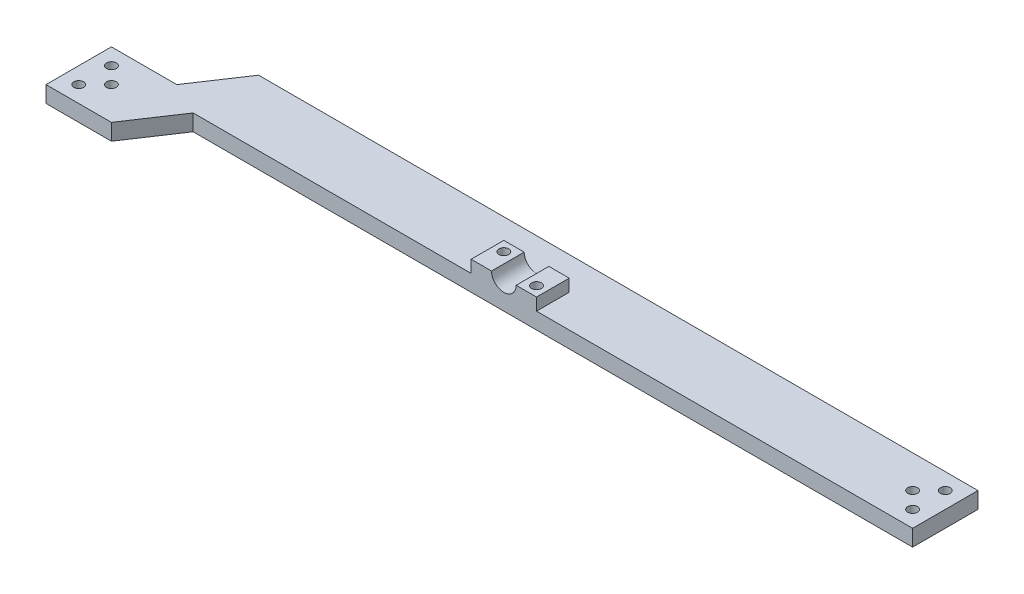
ISO-10303-21;
HEADER;
FILE_DESCRIPTION(('STEP AP214'),'2;1');
FILE_NAME('part.step','',(''),(''),'','','');
FILE_SCHEMA(('AUTOMOTIVE_DESIGN { 1 0 10303 214 1 1 1 1 }'));
ENDSEC;
DATA;
#1=APPLICATION_CONTEXT('core data for automotive mechanical design processes');
#2=APPLICATION_PROTOCOL_DEFINITION('international standard','automotive_design',2000,#1);
#3=PRODUCT_CONTEXT('',#1,'mechanical');
#4=PRODUCT('Part','Part','',(#3));
#5=PRODUCT_RELATED_PRODUCT_CATEGORY('part','',(#4));
#6=PRODUCT_DEFINITION_FORMATION('','',#4);
#7=PRODUCT_DEFINITION_CONTEXT('part definition',#1,'design');
#8=PRODUCT_DEFINITION('design','',#6,#7);
#9=PRODUCT_DEFINITION_SHAPE('','',#8);
#10=(LENGTH_UNIT() NAMED_UNIT(*) SI_UNIT(.MILLI.,.METRE.));
#11=(NAMED_UNIT(*) PLANE_ANGLE_UNIT() SI_UNIT($,.RADIAN.));
#12=(NAMED_UNIT(*) SI_UNIT($,.STERADIAN.) SOLID_ANGLE_UNIT());
#13=UNCERTAINTY_MEASURE_WITH_UNIT(LENGTH_MEASURE(1.E-05),#10,'distance_accuracy_value','');
#14=(GEOMETRIC_REPRESENTATION_CONTEXT(3) GLOBAL_UNCERTAINTY_ASSIGNED_CONTEXT((#13)) GLOBAL_UNIT_ASSIGNED_CONTEXT((#10,
#11,#12)) REPRESENTATION_CONTEXT('',''));
#15=CARTESIAN_POINT('',(0.,0.,0.));
#16=DIRECTION('',(0.,0.,1.));
#17=DIRECTION('',(1.,0.,0.));
#18=AXIS2_PLACEMENT_3D('',#15,#16,#17);
#19=CARTESIAN_POINT('',(52.4814785756053,8.75,-25.));
#20=DIRECTION('',(0.,0.,1.));
#21=DIRECTION('',(1.,0.,0.));
#22=AXIS2_PLACEMENT_3D('',#19,#20,#21);
#23=PLANE('',#22);
#24=DIRECTION('',(-1.,0.,0.));
#25=VECTOR('',#24,1.);
#26=CARTESIAN_POINT('',(52.4814785756053,8.75,-25.));
#27=LINE('',#26,#25);
#28=CARTESIAN_POINT('',(58.7064785756053,8.75,-25.));
#29=VERTEX_POINT('',#28);
#30=CARTESIAN_POINT('',(52.4814785756053,8.75,-25.));
#31=VERTEX_POINT('',#30);
#32=EDGE_CURVE('E152',#29,#31,#27,.T.);
#33=ORIENTED_EDGE('',*,*,#32,.F.);
#34=CARTESIAN_POINT('',(62.4814785756053,8.75,-25.));
#35=DIRECTION('',(0.,0.,-1.));
#36=DIRECTION('',(-1.,0.,0.));
#37=AXIS2_PLACEMENT_3D('',#34,#35,#36);
#38=CIRCLE('',#37,3.775);
#39=CARTESIAN_POINT('',(62.0477447862828,5.,-25.));
#40=VERTEX_POINT('',#39);
#41=EDGE_CURVE('E140',#40,#29,#38,.T.);
#42=ORIENTED_EDGE('',*,*,#41,.F.);
#43=DIRECTION('',(-1.,0.,0.));
#44=VECTOR('',#43,1.);
#45=CARTESIAN_POINT('',(52.4814785756053,5.,-25.));
#46=LINE('',#45,#44);
#47=CARTESIAN_POINT('',(52.4814785756053,5.,-25.));
#48=VERTEX_POINT('',#47);
#49=EDGE_CURVE('E56',#40,#48,#46,.T.);
#50=ORIENTED_EDGE('',*,*,#49,.T.);
#51=DIRECTION('',(0.,-1.,0.));
#52=VECTOR('',#51,1.);
#53=CARTESIAN_POINT('',(52.4814785756053,8.75,-25.));
#54=LINE('',#53,#52);
#55=EDGE_CURVE('E155',#31,#48,#54,.T.);
#56=ORIENTED_EDGE('',*,*,#55,.F.);
#57=EDGE_LOOP('',(#33,#42,#50,#56));
#58=FACE_BOUND('',#57,.T.);
#59=ADVANCED_FACE('F33',(#58),#23,.F.);
#60=CARTESIAN_POINT('',(0.,8.75,0.));
#61=DIRECTION('',(0.,-1.,0.));
#62=DIRECTION('',(0.,0.,-1.));
#63=AXIS2_PLACEMENT_3D('',#60,#61,#62);
#64=PLANE('',#63);
#65=CARTESIAN_POINT('',(55.4814785756053,8.75,-22.));
#66=DIRECTION('',(0.,1.,0.));
#67=DIRECTION('',(0.,0.,1.));
#68=AXIS2_PLACEMENT_3D('',#65,#66,#67);
#69=CIRCLE('',#68,1.5);
#70=CARTESIAN_POINT('',(55.4814785756053,8.75,-20.5));
#71=VERTEX_POINT('',#70);
#72=EDGE_CURVE('E322',#71,#71,#69,.T.);
#73=ORIENTED_EDGE('',*,*,#72,.F.);
#74=EDGE_LOOP('',(#73));
#75=FACE_BOUND('',#74,.T.);
#76=DIRECTION('',(1.,0.,0.));
#77=VECTOR('',#76,1.);
#78=CARTESIAN_POINT('',(52.4814785756053,8.75,-15.));
#79=LINE('',#78,#77);
#80=CARTESIAN_POINT('',(52.4814785756053,8.75,-15.));
#81=VERTEX_POINT('',#80);
#82=CARTESIAN_POINT('',(58.7064785756053,8.75,-15.));
#83=VERTEX_POINT('',#82);
#84=EDGE_CURVE('E153',#81,#83,#79,.T.);
#85=ORIENTED_EDGE('',*,*,#84,.T.);
#86=DIRECTION('',(0.,0.,-1.));
#87=VECTOR('',#86,1.);
#88=CARTESIAN_POINT('',(58.7064785756053,8.75,-15.));
#89=LINE('',#88,#87);
#90=EDGE_CURVE('E11',#83,#29,#89,.T.);
#91=ORIENTED_EDGE('',*,*,#90,.T.);
#92=ORIENTED_EDGE('',*,*,#32,.T.);
#93=DIRECTION('',(0.,0.,1.));
#94=VECTOR('',#93,1.);
#95=CARTESIAN_POINT('',(52.4814785756053,8.75,-15.));
#96=LINE('',#95,#94);
#97=EDGE_CURVE('E278',#31,#81,#96,.T.);
#98=ORIENTED_EDGE('',*,*,#97,.T.);
#99=EDGE_LOOP('',(#85,#91,#92,#98));
#100=FACE_BOUND('',#99,.T.);
#101=ADVANCED_FACE('F150',(#75,#100),#64,.F.);
#102=CARTESIAN_POINT('',(0.,5.,0.));
#103=DIRECTION('',(0.,-1.,0.));
#104=DIRECTION('',(0.,0.,-1.));
#105=AXIS2_PLACEMENT_3D('',#102,#103,#104);
#106=PLANE('',#105);
#107=CARTESIAN_POINT('',(-52.5185214243947,5.,-10.));
#108=DIRECTION('',(0.,1.,0.));
#109=DIRECTION('',(0.,0.,1.));
#110=AXIS2_PLACEMENT_3D('',#107,#108,#109);
#111=CIRCLE('',#110,1.5);
#112=CARTESIAN_POINT('',(-52.5185214243947,5.,-8.49999999999999));
#113=VERTEX_POINT('',#112);
#114=EDGE_CURVE('E316',#113,#113,#111,.T.);
#115=ORIENTED_EDGE('',*,*,#114,.F.);
#116=EDGE_LOOP('',(#115));
#117=FACE_BOUND('',#116,.T.);
#118=CARTESIAN_POINT('',(-57.5185214243947,5.,-15.));
#119=DIRECTION('',(0.,1.,0.));
#120=DIRECTION('',(0.,0.,1.));
#121=AXIS2_PLACEMENT_3D('',#118,#119,#120);
#122=CIRCLE('',#121,1.5);
#123=CARTESIAN_POINT('',(-57.5185214243947,5.,-13.5));
#124=VERTEX_POINT('',#123);
#125=EDGE_CURVE('E310',#124,#124,#122,.T.);
#126=ORIENTED_EDGE('',*,*,#125,.F.);
#127=EDGE_LOOP('',(#126));
#128=FACE_BOUND('',#127,.T.);
#129=CARTESIAN_POINT('',(-57.5185214243947,5.,-5.));
#130=DIRECTION('',(0.,1.,0.));
#131=DIRECTION('',(0.,0.,1.));
#132=AXIS2_PLACEMENT_3D('',#129,#130,#131);
#133=CIRCLE('',#132,1.5);
#134=CARTESIAN_POINT('',(-57.5185214243947,5.,-3.5));
#135=VERTEX_POINT('',#134);
#136=EDGE_CURVE('E304',#135,#135,#133,.T.);
#137=ORIENTED_EDGE('',*,*,#136,.F.);
#138=EDGE_LOOP('',(#137));
#139=FACE_BOUND('',#138,.T.);
#140=CARTESIAN_POINT('',(182.481478575605,5.,-30.));
#141=DIRECTION('',(0.,1.,0.));
#142=DIRECTION('',(0.,0.,1.));
#143=AXIS2_PLACEMENT_3D('',#140,#141,#142);
#144=CIRCLE('',#143,1.5);
#145=CARTESIAN_POINT('',(182.481478575605,5.,-28.5));
#146=VERTEX_POINT('',#145);
#147=EDGE_CURVE('E298',#146,#146,#144,.T.);
#148=ORIENTED_EDGE('',*,*,#147,.F.);
#149=EDGE_LOOP('',(#148));
#150=FACE_BOUND('',#149,.T.);
#151=CARTESIAN_POINT('',(177.481478575605,5.,-25.));
#152=DIRECTION('',(0.,1.,0.));
#153=DIRECTION('',(0.,0.,1.));
#154=AXIS2_PLACEMENT_3D('',#151,#152,#153);
#155=CIRCLE('',#154,1.5);
#156=CARTESIAN_POINT('',(177.481478575605,5.,-23.5));
#157=VERTEX_POINT('',#156);
#158=EDGE_CURVE('E292',#157,#157,#155,.T.);
#159=ORIENTED_EDGE('',*,*,#158,.F.);
#160=EDGE_LOOP('',(#159));
#161=FACE_BOUND('',#160,.T.);
#162=CARTESIAN_POINT('',(182.481478575605,5.,-20.));
#163=DIRECTION('',(0.,1.,0.));
#164=DIRECTION('',(0.,0.,1.));
#165=AXIS2_PLACEMENT_3D('',#162,#163,#164);
#166=CIRCLE('',#165,1.5);
#167=CARTESIAN_POINT('',(182.481478575605,5.,-18.5));
#168=VERTEX_POINT('',#167);
#169=EDGE_CURVE('E286',#168,#168,#166,.T.);
#170=ORIENTED_EDGE('',*,*,#169,.F.);
#171=EDGE_LOOP('',(#170));
#172=FACE_BOUND('',#171,.T.);
#173=DIRECTION('',(0.,0.,1.));
#174=VECTOR('',#173,1.);
#175=CARTESIAN_POINT('',(52.4814785756053,5.,-15.));
#176=LINE('',#175,#174);
#177=CARTESIAN_POINT('',(52.4814785756053,5.,-15.));
#178=VERTEX_POINT('',#177);
#179=EDGE_CURVE('E169',#48,#178,#176,.T.);
#180=ORIENTED_EDGE('',*,*,#179,.F.);
#181=ORIENTED_EDGE('',*,*,#49,.F.);
#182=DIRECTION('',(1.,0.,0.));
#183=VECTOR('',#182,1.);
#184=CARTESIAN_POINT('',(0.,5.,-25.));
#185=LINE('',#184,#183);
#186=CARTESIAN_POINT('',(62.9152123649277,5.,-25.));
#187=VERTEX_POINT('',#186);
#188=EDGE_CURVE('E173',#40,#187,#185,.T.);
#189=ORIENTED_EDGE('',*,*,#188,.T.);
#190=CARTESIAN_POINT('',(72.4814785756053,5.,-25.));
#191=VERTEX_POINT('',#190);
#192=EDGE_CURVE('E166',#191,#187,#46,.T.);
#193=ORIENTED_EDGE('',*,*,#192,.F.);
#194=DIRECTION('',(0.,0.,-1.));
#195=VECTOR('',#194,1.);
#196=CARTESIAN_POINT('',(72.4814785756053,5.,-15.));
#197=LINE('',#196,#195);
#198=CARTESIAN_POINT('',(72.4814785756053,5.,-15.));
#199=VERTEX_POINT('',#198);
#200=EDGE_CURVE('E172',#199,#191,#197,.T.);
#201=ORIENTED_EDGE('',*,*,#200,.F.);
#202=DIRECTION('',(1.,0.,0.));
#203=VECTOR('',#202,1.);
#204=CARTESIAN_POINT('',(187.481478575605,5.,-15.));
#205=LINE('',#204,#203);
#206=CARTESIAN_POINT('',(187.481478575605,5.,-15.));
#207=VERTEX_POINT('',#206);
#208=EDGE_CURVE('E194',#199,#207,#205,.T.);
#209=ORIENTED_EDGE('',*,*,#208,.T.);
#210=DIRECTION('',(0.,0.,-1.));
#211=VECTOR('',#210,1.);
#212=CARTESIAN_POINT('',(187.481478575605,5.,-35.));
#213=LINE('',#212,#211);
#214=CARTESIAN_POINT('',(187.481478575605,5.,-35.));
#215=VERTEX_POINT('',#214);
#216=EDGE_CURVE('E193',#207,#215,#213,.T.);
#217=ORIENTED_EDGE('',*,*,#216,.T.);
#218=DIRECTION('',(-1.,0.,0.));
#219=VECTOR('',#218,1.);
#220=CARTESIAN_POINT('',(-32.5185214243947,5.,-35.));
#221=LINE('',#220,#219);
#222=CARTESIAN_POINT('',(-32.5185214243947,5.,-35.));
#223=VERTEX_POINT('',#222);
#224=EDGE_CURVE('E203',#215,#223,#221,.T.);
#225=ORIENTED_EDGE('',*,*,#224,.T.);
#226=DIRECTION('',(-0.554700196225229,0.,0.832050294337844));
#227=VECTOR('',#226,1.);
#228=CARTESIAN_POINT('',(-42.5185214243947,5.,-20.));
#229=LINE('',#228,#227);
#230=CARTESIAN_POINT('',(-42.5185214243947,5.,-20.));
#231=VERTEX_POINT('',#230);
#232=EDGE_CURVE('E223',#223,#231,#229,.T.);
#233=ORIENTED_EDGE('',*,*,#232,.T.);
#234=DIRECTION('',(-1.,0.,0.));
#235=VECTOR('',#234,1.);
#236=CARTESIAN_POINT('',(-62.5185214243947,5.,-20.));
#237=LINE('',#236,#235);
#238=CARTESIAN_POINT('',(-62.5185214243947,5.,-20.));
#239=VERTEX_POINT('',#238);
#240=EDGE_CURVE('E267',#231,#239,#237,.T.);
#241=ORIENTED_EDGE('',*,*,#240,.T.);
#242=DIRECTION('',(0.,0.,1.));
#243=VECTOR('',#242,1.);
#244=CARTESIAN_POINT('',(-62.5185214243947,5.,0.));
#245=LINE('',#244,#243);
#246=CARTESIAN_POINT('',(-62.5185214243947,5.,0.));
#247=VERTEX_POINT('',#246);
#248=EDGE_CURVE('E266',#239,#247,#245,.T.);
#249=ORIENTED_EDGE('',*,*,#248,.T.);
#250=DIRECTION('',(1.,0.,0.));
#251=VECTOR('',#250,1.);
#252=CARTESIAN_POINT('',(-42.5185214243947,5.,0.));
#253=LINE('',#252,#251);
#254=CARTESIAN_POINT('',(-42.5185214243947,5.,0.));
#255=VERTEX_POINT('',#254);
#256=EDGE_CURVE('E244',#247,#255,#253,.T.);
#257=ORIENTED_EDGE('',*,*,#256,.T.);
#258=DIRECTION('',(0.55470019622523,0.,-0.832050294337843));
#259=VECTOR('',#258,1.);
#260=CARTESIAN_POINT('',(-32.5185214243947,5.,-15.));
#261=LINE('',#260,#259);
#262=CARTESIAN_POINT('',(-32.5185214243947,5.,-15.));
#263=VERTEX_POINT('',#262);
#264=EDGE_CURVE('E199',#255,#263,#261,.T.);
#265=ORIENTED_EDGE('',*,*,#264,.T.);
#266=EDGE_CURVE('E190',#263,#178,#205,.T.);
#267=ORIENTED_EDGE('',*,*,#266,.T.);
#268=EDGE_LOOP('',(#180,#181,#189,#193,#201,#209,#217,#225,#233,#241,#249,#257,#265,#267));
#269=FACE_BOUND('',#268,.T.);
#270=ADVANCED_FACE('F265',(#117,#128,#139,#150,#161,#172,#269),#106,.F.);
#271=CARTESIAN_POINT('',(-42.5185214243947,5.,-20.));
#272=DIRECTION('',(0.832050294337844,0.,0.554700196225229));
#273=DIRECTION('',(0.554700196225229,0.,-0.832050294337844));
#274=AXIS2_PLACEMENT_3D('',#271,#272,#273);
#275=PLANE('',#274);
#276=DIRECTION('',(-0.554700196225229,0.,0.832050294337844));
#277=VECTOR('',#276,1.);
#278=CARTESIAN_POINT('',(-42.5185214243947,0.,-20.));
#279=LINE('',#278,#277);
#280=CARTESIAN_POINT('',(-32.5185214243947,0.,-35.));
#281=VERTEX_POINT('',#280);
#282=CARTESIAN_POINT('',(-42.5185214243947,0.,-20.));
#283=VERTEX_POINT('',#282);
#284=EDGE_CURVE('E206',#281,#283,#279,.T.);
#285=ORIENTED_EDGE('',*,*,#284,.T.);
#286=DIRECTION('',(0.,-1.,0.));
#287=VECTOR('',#286,1.);
#288=CARTESIAN_POINT('',(-42.5185214243947,5.,-20.));
#289=LINE('',#288,#287);
#290=EDGE_CURVE('E176',#231,#283,#289,.T.);
#291=ORIENTED_EDGE('',*,*,#290,.F.);
#292=ORIENTED_EDGE('',*,*,#232,.F.);
#293=DIRECTION('',(0.,-1.,0.));
#294=VECTOR('',#293,1.);
#295=CARTESIAN_POINT('',(-32.5185214243947,5.,-35.));
#296=LINE('',#295,#294);
#297=EDGE_CURVE('E205',#223,#281,#296,.T.);
#298=ORIENTED_EDGE('',*,*,#297,.T.);
#299=EDGE_LOOP('',(#285,#291,#292,#298));
#300=FACE_BOUND('',#299,.T.);
#301=ADVANCED_FACE('F35',(#300),#275,.F.);
#302=CARTESIAN_POINT('',(-62.5185214243947,5.,-20.));
#303=DIRECTION('',(0.,0.,1.));
#304=DIRECTION('',(1.,0.,0.));
#305=AXIS2_PLACEMENT_3D('',#302,#303,#304);
#306=PLANE('',#305);
#307=DIRECTION('',(-1.,0.,0.));
#308=VECTOR('',#307,1.);
#309=CARTESIAN_POINT('',(-62.5185214243947,0.,-20.));
#310=LINE('',#309,#308);
#311=CARTESIAN_POINT('',(-62.5185214243947,0.,-20.));
#312=VERTEX_POINT('',#311);
#313=EDGE_CURVE('E208',#283,#312,#310,.T.);
#314=ORIENTED_EDGE('',*,*,#313,.T.);
#315=DIRECTION('',(0.,-1.,0.));
#316=VECTOR('',#315,1.);
#317=CARTESIAN_POINT('',(-62.5185214243947,5.,-20.));
#318=LINE('',#317,#316);
#319=EDGE_CURVE('E180',#239,#312,#318,.T.);
#320=ORIENTED_EDGE('',*,*,#319,.F.);
#321=ORIENTED_EDGE('',*,*,#240,.F.);
#322=ORIENTED_EDGE('',*,*,#290,.T.);
#323=EDGE_LOOP('',(#314,#320,#321,#322));
#324=FACE_BOUND('',#323,.T.);
#325=ADVANCED_FACE('F406',(#324),#306,.F.);
#326=CARTESIAN_POINT('',(-62.5185214243947,5.,0.));
#327=DIRECTION('',(1.,0.,0.));
#328=DIRECTION('',(0.,0.,-1.));
#329=AXIS2_PLACEMENT_3D('',#326,#327,#328);
#330=PLANE('',#329);
#331=DIRECTION('',(0.,0.,1.));
#332=VECTOR('',#331,1.);
#333=CARTESIAN_POINT('',(-62.5185214243947,0.,0.));
#334=LINE('',#333,#332);
#335=CARTESIAN_POINT('',(-62.5185214243947,0.,0.));
#336=VERTEX_POINT('',#335);
#337=EDGE_CURVE('E211',#312,#336,#334,.T.);
#338=ORIENTED_EDGE('',*,*,#337,.T.);
#339=DIRECTION('',(0.,-1.,0.));
#340=VECTOR('',#339,1.);
#341=CARTESIAN_POINT('',(-62.5185214243947,5.,0.));
#342=LINE('',#341,#340);
#343=EDGE_CURVE('E186',#247,#336,#342,.T.);
#344=ORIENTED_EDGE('',*,*,#343,.F.);
#345=ORIENTED_EDGE('',*,*,#248,.F.);
#346=ORIENTED_EDGE('',*,*,#319,.T.);
#347=EDGE_LOOP('',(#338,#344,#345,#346));
#348=FACE_BOUND('',#347,.T.);
#349=ADVANCED_FACE('F404',(#348),#330,.F.);
#350=CARTESIAN_POINT('',(-42.5185214243947,5.,0.));
#351=DIRECTION('',(0.,0.,-1.));
#352=DIRECTION('',(-1.,0.,0.));
#353=AXIS2_PLACEMENT_3D('',#350,#351,#352);
#354=PLANE('',#353);
#355=DIRECTION('',(1.,0.,0.));
#356=VECTOR('',#355,1.);
#357=CARTESIAN_POINT('',(-42.5185214243947,0.,0.));
#358=LINE('',#357,#356);
#359=CARTESIAN_POINT('',(-42.5185214243947,0.,0.));
#360=VERTEX_POINT('',#359);
#361=EDGE_CURVE('E213',#336,#360,#358,.T.);
#362=ORIENTED_EDGE('',*,*,#361,.T.);
#363=DIRECTION('',(0.,-1.,0.));
#364=VECTOR('',#363,1.);
#365=CARTESIAN_POINT('',(-42.5185214243947,5.,0.));
#366=LINE('',#365,#364);
#367=EDGE_CURVE('E235',#255,#360,#366,.T.);
#368=ORIENTED_EDGE('',*,*,#367,.F.);
#369=ORIENTED_EDGE('',*,*,#256,.F.);
#370=ORIENTED_EDGE('',*,*,#343,.T.);
#371=EDGE_LOOP('',(#362,#368,#369,#370));
#372=FACE_BOUND('',#371,.T.);
#373=ADVANCED_FACE('F242',(#372),#354,.F.);
#374=CARTESIAN_POINT('',(-32.5185214243947,5.,-15.));
#375=DIRECTION('',(-0.832050294337843,0.,-0.55470019622523));
#376=DIRECTION('',(-0.55470019622523,0.,0.832050294337843));
#377=AXIS2_PLACEMENT_3D('',#374,#375,#376);
#378=PLANE('',#377);
#379=DIRECTION('',(0.55470019622523,0.,-0.832050294337843));
#380=VECTOR('',#379,1.);
#381=CARTESIAN_POINT('',(-32.5185214243947,0.,-15.));
#382=LINE('',#381,#380);
#383=CARTESIAN_POINT('',(-32.5185214243947,0.,-15.));
#384=VERTEX_POINT('',#383);
#385=EDGE_CURVE('E215',#360,#384,#382,.T.);
#386=ORIENTED_EDGE('',*,*,#385,.T.);
#387=DIRECTION('',(0.,-1.,0.));
#388=VECTOR('',#387,1.);
#389=CARTESIAN_POINT('',(-32.5185214243947,5.,-15.));
#390=LINE('',#389,#388);
#391=EDGE_CURVE('E232',#263,#384,#390,.T.);
#392=ORIENTED_EDGE('',*,*,#391,.F.);
#393=ORIENTED_EDGE('',*,*,#264,.F.);
#394=ORIENTED_EDGE('',*,*,#367,.T.);
#395=EDGE_LOOP('',(#386,#392,#393,#394));
#396=FACE_BOUND('',#395,.T.);
#397=ADVANCED_FACE('F256',(#396),#378,.F.);
#398=CARTESIAN_POINT('',(187.481478575605,5.,-15.));
#399=DIRECTION('',(0.,0.,-1.));
#400=DIRECTION('',(-1.,0.,0.));
#401=AXIS2_PLACEMENT_3D('',#398,#399,#400);
#402=PLANE('',#401);
#403=CARTESIAN_POINT('',(66.2564785756053,8.75,-15.));
#404=VERTEX_POINT('',#403);
#405=CARTESIAN_POINT('',(72.4814785756053,8.75,-15.));
#406=VERTEX_POINT('',#405);
#407=EDGE_CURVE('E279',#404,#406,#79,.T.);
#408=ORIENTED_EDGE('',*,*,#407,.F.);
#409=CARTESIAN_POINT('',(62.4814785756053,8.75,-15.));
#410=DIRECTION('',(0.,0.,-1.));
#411=DIRECTION('',(-1.,0.,0.));
#412=AXIS2_PLACEMENT_3D('',#409,#410,#411);
#413=CIRCLE('',#412,3.775);
#414=EDGE_CURVE('E48',#404,#83,#413,.T.);
#415=ORIENTED_EDGE('',*,*,#414,.T.);
#416=ORIENTED_EDGE('',*,*,#84,.F.);
#417=DIRECTION('',(0.,-1.,0.));
#418=VECTOR('',#417,1.);
#419=CARTESIAN_POINT('',(52.4814785756053,8.75,-15.));
#420=LINE('',#419,#418);
#421=EDGE_CURVE('E209',#81,#178,#420,.T.);
#422=ORIENTED_EDGE('',*,*,#421,.T.);
#423=ORIENTED_EDGE('',*,*,#266,.F.);
#424=ORIENTED_EDGE('',*,*,#391,.T.);
#425=DIRECTION('',(1.,0.,0.));
#426=VECTOR('',#425,1.);
#427=CARTESIAN_POINT('',(187.481478575605,0.,-15.));
#428=LINE('',#427,#426);
#429=CARTESIAN_POINT('',(187.481478575605,0.,-15.));
#430=VERTEX_POINT('',#429);
#431=EDGE_CURVE('E217',#384,#430,#428,.T.);
#432=ORIENTED_EDGE('',*,*,#431,.T.);
#433=DIRECTION('',(0.,-1.,0.));
#434=VECTOR('',#433,1.);
#435=CARTESIAN_POINT('',(187.481478575605,5.,-15.));
#436=LINE('',#435,#434);
#437=EDGE_CURVE('E229',#207,#430,#436,.T.);
#438=ORIENTED_EDGE('',*,*,#437,.F.);
#439=ORIENTED_EDGE('',*,*,#208,.F.);
#440=DIRECTION('',(0.,-1.,0.));
#441=VECTOR('',#440,1.);
#442=CARTESIAN_POINT('',(72.4814785756053,8.75,-15.));
#443=LINE('',#442,#441);
#444=EDGE_CURVE('E275',#406,#199,#443,.T.);
#445=ORIENTED_EDGE('',*,*,#444,.F.);
#446=EDGE_LOOP('',(#408,#415,#416,#422,#423,#424,#432,#438,#439,#445));
#447=FACE_BOUND('',#446,.T.);
#448=ADVANCED_FACE('F260',(#447),#402,.F.);
#449=CARTESIAN_POINT('',(187.481478575605,5.,-35.));
#450=DIRECTION('',(-1.,0.,0.));
#451=DIRECTION('',(0.,0.,1.));
#452=AXIS2_PLACEMENT_3D('',#449,#450,#451);
#453=PLANE('',#452);
#454=DIRECTION('',(0.,0.,-1.));
#455=VECTOR('',#454,1.);
#456=CARTESIAN_POINT('',(187.481478575605,0.,-35.));
#457=LINE('',#456,#455);
#458=CARTESIAN_POINT('',(187.481478575605,0.,-35.));
#459=VERTEX_POINT('',#458);
#460=EDGE_CURVE('E219',#430,#459,#457,.T.);
#461=ORIENTED_EDGE('',*,*,#460,.T.);
#462=DIRECTION('',(0.,-1.,0.));
#463=VECTOR('',#462,1.);
#464=CARTESIAN_POINT('',(187.481478575605,5.,-35.));
#465=LINE('',#464,#463);
#466=EDGE_CURVE('E226',#215,#459,#465,.T.);
#467=ORIENTED_EDGE('',*,*,#466,.F.);
#468=ORIENTED_EDGE('',*,*,#216,.F.);
#469=ORIENTED_EDGE('',*,*,#437,.T.);
#470=EDGE_LOOP('',(#461,#467,#468,#469));
#471=FACE_BOUND('',#470,.T.);
#472=ADVANCED_FACE('F393',(#471),#453,.F.);
#473=CARTESIAN_POINT('',(-32.5185214243947,5.,-35.));
#474=DIRECTION('',(0.,0.,1.));
#475=DIRECTION('',(1.,0.,0.));
#476=AXIS2_PLACEMENT_3D('',#473,#474,#475);
#477=PLANE('',#476);
#478=DIRECTION('',(-1.,0.,0.));
#479=VECTOR('',#478,1.);
#480=CARTESIAN_POINT('',(-32.5185214243947,0.,-35.));
#481=LINE('',#480,#479);
#482=EDGE_CURVE('E221',#459,#281,#481,.T.);
#483=ORIENTED_EDGE('',*,*,#482,.T.);
#484=ORIENTED_EDGE('',*,*,#297,.F.);
#485=ORIENTED_EDGE('',*,*,#224,.F.);
#486=ORIENTED_EDGE('',*,*,#466,.T.);
#487=EDGE_LOOP('',(#483,#484,#485,#486));
#488=FACE_BOUND('',#487,.T.);
#489=ADVANCED_FACE('F389',(#488),#477,.F.);
#490=CARTESIAN_POINT('',(0.,0.,0.));
#491=DIRECTION('',(0.,-1.,0.));
#492=DIRECTION('',(0.,0.,-1.));
#493=AXIS2_PLACEMENT_3D('',#490,#491,#492);
#494=PLANE('',#493);
#495=CARTESIAN_POINT('',(-52.5185214243947,0.,-10.));
#496=DIRECTION('',(0.,1.,0.));
#497=DIRECTION('',(0.,0.,1.));
#498=AXIS2_PLACEMENT_3D('',#495,#496,#497);
#499=CIRCLE('',#498,1.5);
#500=CARTESIAN_POINT('',(-52.5185214243947,0.,-8.49999999999999));
#501=VERTEX_POINT('',#500);
#502=EDGE_CURVE('E313',#501,#501,#499,.T.);
#503=ORIENTED_EDGE('',*,*,#502,.T.);
#504=EDGE_LOOP('',(#503));
#505=FACE_BOUND('',#504,.T.);
#506=CARTESIAN_POINT('',(-57.5185214243947,0.,-15.));
#507=DIRECTION('',(0.,1.,0.));
#508=DIRECTION('',(0.,0.,1.));
#509=AXIS2_PLACEMENT_3D('',#506,#507,#508);
#510=CIRCLE('',#509,1.5);
#511=CARTESIAN_POINT('',(-57.5185214243947,0.,-13.5));
#512=VERTEX_POINT('',#511);
#513=EDGE_CURVE('E307',#512,#512,#510,.T.);
#514=ORIENTED_EDGE('',*,*,#513,.T.);
#515=EDGE_LOOP('',(#514));
#516=FACE_BOUND('',#515,.T.);
#517=CARTESIAN_POINT('',(-57.5185214243947,0.,-5.));
#518=DIRECTION('',(0.,1.,0.));
#519=DIRECTION('',(0.,0.,1.));
#520=AXIS2_PLACEMENT_3D('',#517,#518,#519);
#521=CIRCLE('',#520,1.5);
#522=CARTESIAN_POINT('',(-57.5185214243947,0.,-3.5));
#523=VERTEX_POINT('',#522);
#524=EDGE_CURVE('E301',#523,#523,#521,.T.);
#525=ORIENTED_EDGE('',*,*,#524,.T.);
#526=EDGE_LOOP('',(#525));
#527=FACE_BOUND('',#526,.T.);
#528=CARTESIAN_POINT('',(182.481478575605,0.,-30.));
#529=DIRECTION('',(0.,1.,0.));
#530=DIRECTION('',(0.,0.,1.));
#531=AXIS2_PLACEMENT_3D('',#528,#529,#530);
#532=CIRCLE('',#531,1.5);
#533=CARTESIAN_POINT('',(182.481478575605,0.,-28.5));
#534=VERTEX_POINT('',#533);
#535=EDGE_CURVE('E295',#534,#534,#532,.T.);
#536=ORIENTED_EDGE('',*,*,#535,.T.);
#537=EDGE_LOOP('',(#536));
#538=FACE_BOUND('',#537,.T.);
#539=CARTESIAN_POINT('',(177.481478575605,0.,-25.));
#540=DIRECTION('',(0.,1.,0.));
#541=DIRECTION('',(0.,0.,1.));
#542=AXIS2_PLACEMENT_3D('',#539,#540,#541);
#543=CIRCLE('',#542,1.5);
#544=CARTESIAN_POINT('',(177.481478575605,0.,-23.5));
#545=VERTEX_POINT('',#544);
#546=EDGE_CURVE('E289',#545,#545,#543,.T.);
#547=ORIENTED_EDGE('',*,*,#546,.T.);
#548=EDGE_LOOP('',(#547));
#549=FACE_BOUND('',#548,.T.);
#550=CARTESIAN_POINT('',(182.481478575605,0.,-20.));
#551=DIRECTION('',(0.,1.,0.));
#552=DIRECTION('',(0.,0.,1.));
#553=AXIS2_PLACEMENT_3D('',#550,#551,#552);
#554=CIRCLE('',#553,1.5);
#555=CARTESIAN_POINT('',(182.481478575605,0.,-18.5));
#556=VERTEX_POINT('',#555);
#557=EDGE_CURVE('E145',#556,#556,#554,.T.);
#558=ORIENTED_EDGE('',*,*,#557,.T.);
#559=EDGE_LOOP('',(#558));
#560=FACE_BOUND('',#559,.T.);
#561=ORIENTED_EDGE('',*,*,#284,.F.);
#562=ORIENTED_EDGE('',*,*,#482,.F.);
#563=ORIENTED_EDGE('',*,*,#460,.F.);
#564=ORIENTED_EDGE('',*,*,#431,.F.);
#565=ORIENTED_EDGE('',*,*,#385,.F.);
#566=ORIENTED_EDGE('',*,*,#361,.F.);
#567=ORIENTED_EDGE('',*,*,#337,.F.);
#568=ORIENTED_EDGE('',*,*,#313,.F.);
#569=EDGE_LOOP('',(#561,#562,#563,#564,#565,#566,#567,#568));
#570=FACE_BOUND('',#569,.T.);
#571=ADVANCED_FACE('F251',(#505,#516,#527,#538,#549,#560,#570),#494,.T.);
#572=CARTESIAN_POINT('',(52.4814785756053,8.75,-15.));
#573=DIRECTION('',(1.,0.,0.));
#574=DIRECTION('',(0.,0.,-1.));
#575=AXIS2_PLACEMENT_3D('',#572,#573,#574);
#576=PLANE('',#575);
#577=ORIENTED_EDGE('',*,*,#179,.T.);
#578=ORIENTED_EDGE('',*,*,#421,.F.);
#579=ORIENTED_EDGE('',*,*,#97,.F.);
#580=ORIENTED_EDGE('',*,*,#55,.T.);
#581=EDGE_LOOP('',(#577,#578,#579,#580));
#582=FACE_BOUND('',#581,.T.);
#583=ADVANCED_FACE('F277',(#582),#576,.F.);
#584=CARTESIAN_POINT('',(72.4814785756053,8.75,-15.));
#585=DIRECTION('',(-1.,0.,0.));
#586=DIRECTION('',(0.,0.,1.));
#587=AXIS2_PLACEMENT_3D('',#584,#585,#586);
#588=PLANE('',#587);
#589=ORIENTED_EDGE('',*,*,#200,.T.);
#590=DIRECTION('',(0.,-1.,0.));
#591=VECTOR('',#590,1.);
#592=CARTESIAN_POINT('',(72.4814785756053,8.75,-25.));
#593=LINE('',#592,#591);
#594=CARTESIAN_POINT('',(72.4814785756053,8.75,-25.));
#595=VERTEX_POINT('',#594);
#596=EDGE_CURVE('E273',#595,#191,#593,.T.);
#597=ORIENTED_EDGE('',*,*,#596,.F.);
#598=DIRECTION('',(0.,0.,-1.));
#599=VECTOR('',#598,1.);
#600=CARTESIAN_POINT('',(72.4814785756053,8.75,-15.));
#601=LINE('',#600,#599);
#602=EDGE_CURVE('E158',#406,#595,#601,.T.);
#603=ORIENTED_EDGE('',*,*,#602,.F.);
#604=ORIENTED_EDGE('',*,*,#444,.T.);
#605=EDGE_LOOP('',(#589,#597,#603,#604));
#606=FACE_BOUND('',#605,.T.);
#607=ADVANCED_FACE('F374',(#606),#588,.F.);
#608=ORIENTED_EDGE('',*,*,#192,.T.);
#609=CARTESIAN_POINT('',(66.2564785756053,8.75,-25.));
#610=VERTEX_POINT('',#609);
#611=EDGE_CURVE('E147',#610,#187,#38,.T.);
#612=ORIENTED_EDGE('',*,*,#611,.F.);
#613=EDGE_CURVE('E157',#595,#610,#27,.T.);
#614=ORIENTED_EDGE('',*,*,#613,.F.);
#615=ORIENTED_EDGE('',*,*,#596,.T.);
#616=EDGE_LOOP('',(#608,#612,#614,#615));
#617=FACE_BOUND('',#616,.T.);
#618=ADVANCED_FACE('F345',(#617),#23,.F.);
#619=CARTESIAN_POINT('',(69.4814785756053,8.75,-18.));
#620=DIRECTION('',(0.,1.,0.));
#621=DIRECTION('',(0.,0.,1.));
#622=AXIS2_PLACEMENT_3D('',#619,#620,#621);
#623=CIRCLE('',#622,1.5);
#624=CARTESIAN_POINT('',(69.4814785756053,8.75,-16.5));
#625=VERTEX_POINT('',#624);
#626=EDGE_CURVE('E328',#625,#625,#623,.T.);
#627=ORIENTED_EDGE('',*,*,#626,.F.);
#628=EDGE_LOOP('',(#627));
#629=FACE_BOUND('',#628,.T.);
#630=ORIENTED_EDGE('',*,*,#613,.T.);
#631=DIRECTION('',(0.,0.,-1.));
#632=VECTOR('',#631,1.);
#633=CARTESIAN_POINT('',(66.2564785756053,8.75,-15.));
#634=LINE('',#633,#632);
#635=EDGE_CURVE('E41',#610,#404,#634,.F.);
#636=ORIENTED_EDGE('',*,*,#635,.T.);
#637=ORIENTED_EDGE('',*,*,#407,.T.);
#638=ORIENTED_EDGE('',*,*,#602,.T.);
#639=EDGE_LOOP('',(#630,#636,#637,#638));
#640=FACE_BOUND('',#639,.T.);
#641=ADVANCED_FACE('F343',(#629,#640),#64,.F.);
#642=CARTESIAN_POINT('',(62.4814785756053,8.75,-15.));
#643=DIRECTION('',(0.,0.,-1.));
#644=DIRECTION('',(-1.,0.,0.));
#645=AXIS2_PLACEMENT_3D('',#642,#643,#644);
#646=CYLINDRICAL_SURFACE('',#645,3.775);
#647=ORIENTED_EDGE('',*,*,#414,.F.);
#648=ORIENTED_EDGE('',*,*,#635,.F.);
#649=ORIENTED_EDGE('',*,*,#611,.T.);
#650=EDGE_CURVE('E143',#187,#40,#38,.T.);
#651=ORIENTED_EDGE('',*,*,#650,.T.);
#652=ORIENTED_EDGE('',*,*,#41,.T.);
#653=ORIENTED_EDGE('',*,*,#90,.F.);
#654=EDGE_LOOP('',(#647,#648,#649,#651,#652,#653));
#655=FACE_BOUND('',#654,.T.);
#656=ADVANCED_FACE('F141',(#655),#646,.F.);
#657=CARTESIAN_POINT('',(62.4814785756053,8.75,-25.));
#658=DIRECTION('',(0.,0.,-1.));
#659=DIRECTION('',(-1.,0.,0.));
#660=AXIS2_PLACEMENT_3D('',#657,#658,#659);
#661=PLANE('',#660);
#662=ORIENTED_EDGE('',*,*,#650,.F.);
#663=ORIENTED_EDGE('',*,*,#188,.F.);
#664=EDGE_LOOP('',(#662,#663));
#665=FACE_BOUND('',#664,.T.);
#666=ADVANCED_FACE('F354',(#665),#661,.F.);
#667=CARTESIAN_POINT('',(182.481478575605,0.,-20.));
#668=DIRECTION('',(0.,1.,0.));
#669=DIRECTION('',(0.,0.,1.));
#670=AXIS2_PLACEMENT_3D('',#667,#668,#669);
#671=CYLINDRICAL_SURFACE('',#670,1.5);
#672=ORIENTED_EDGE('',*,*,#557,.F.);
#673=EDGE_LOOP('',(#672));
#674=FACE_BOUND('',#673,.T.);
#675=ORIENTED_EDGE('',*,*,#169,.T.);
#676=EDGE_LOOP('',(#675));
#677=FACE_BOUND('',#676,.T.);
#678=ADVANCED_FACE('F356',(#674,#677),#671,.F.);
#679=CARTESIAN_POINT('',(177.481478575605,0.,-25.));
#680=DIRECTION('',(0.,1.,0.));
#681=DIRECTION('',(0.,0.,1.));
#682=AXIS2_PLACEMENT_3D('',#679,#680,#681);
#683=CYLINDRICAL_SURFACE('',#682,1.5);
#684=ORIENTED_EDGE('',*,*,#546,.F.);
#685=EDGE_LOOP('',(#684));
#686=FACE_BOUND('',#685,.T.);
#687=ORIENTED_EDGE('',*,*,#158,.T.);
#688=EDGE_LOOP('',(#687));
#689=FACE_BOUND('',#688,.T.);
#690=ADVANCED_FACE('F362',(#686,#689),#683,.F.);
#691=CARTESIAN_POINT('',(182.481478575605,0.,-30.));
#692=DIRECTION('',(0.,1.,0.));
#693=DIRECTION('',(0.,0.,1.));
#694=AXIS2_PLACEMENT_3D('',#691,#692,#693);
#695=CYLINDRICAL_SURFACE('',#694,1.5);
#696=ORIENTED_EDGE('',*,*,#535,.F.);
#697=EDGE_LOOP('',(#696));
#698=FACE_BOUND('',#697,.T.);
#699=ORIENTED_EDGE('',*,*,#147,.T.);
#700=EDGE_LOOP('',(#699));
#701=FACE_BOUND('',#700,.T.);
#702=ADVANCED_FACE('F499',(#698,#701),#695,.F.);
#703=CARTESIAN_POINT('',(-57.5185214243947,0.,-5.));
#704=DIRECTION('',(0.,1.,0.));
#705=DIRECTION('',(0.,0.,1.));
#706=AXIS2_PLACEMENT_3D('',#703,#704,#705);
#707=CYLINDRICAL_SURFACE('',#706,1.5);
#708=ORIENTED_EDGE('',*,*,#524,.F.);
#709=EDGE_LOOP('',(#708));
#710=FACE_BOUND('',#709,.T.);
#711=ORIENTED_EDGE('',*,*,#136,.T.);
#712=EDGE_LOOP('',(#711));
#713=FACE_BOUND('',#712,.T.);
#714=ADVANCED_FACE('F495',(#710,#713),#707,.F.);
#715=CARTESIAN_POINT('',(-57.5185214243947,0.,-15.));
#716=DIRECTION('',(0.,1.,0.));
#717=DIRECTION('',(0.,0.,1.));
#718=AXIS2_PLACEMENT_3D('',#715,#716,#717);
#719=CYLINDRICAL_SURFACE('',#718,1.5);
#720=ORIENTED_EDGE('',*,*,#513,.F.);
#721=EDGE_LOOP('',(#720));
#722=FACE_BOUND('',#721,.T.);
#723=ORIENTED_EDGE('',*,*,#125,.T.);
#724=EDGE_LOOP('',(#723));
#725=FACE_BOUND('',#724,.T.);
#726=ADVANCED_FACE('F491',(#722,#725),#719,.F.);
#727=CARTESIAN_POINT('',(-52.5185214243947,0.,-10.));
#728=DIRECTION('',(0.,1.,0.));
#729=DIRECTION('',(0.,0.,1.));
#730=AXIS2_PLACEMENT_3D('',#727,#728,#729);
#731=CYLINDRICAL_SURFACE('',#730,1.5);
#732=ORIENTED_EDGE('',*,*,#502,.F.);
#733=EDGE_LOOP('',(#732));
#734=FACE_BOUND('',#733,.T.);
#735=ORIENTED_EDGE('',*,*,#114,.T.);
#736=EDGE_LOOP('',(#735));
#737=FACE_BOUND('',#736,.T.);
#738=ADVANCED_FACE('F446',(#734,#737),#731,.F.);
#739=CARTESIAN_POINT('',(55.4814785756053,4.75,-22.));
#740=DIRECTION('',(0.,1.,0.));
#741=DIRECTION('',(0.,0.,1.));
#742=AXIS2_PLACEMENT_3D('',#739,#740,#741);
#743=CYLINDRICAL_SURFACE('',#742,1.5);
#744=CARTESIAN_POINT('',(55.4814785756053,4.75,-22.));
#745=DIRECTION('',(0.,1.,0.));
#746=DIRECTION('',(0.,0.,1.));
#747=AXIS2_PLACEMENT_3D('',#744,#745,#746);
#748=CIRCLE('',#747,1.5);
#749=CARTESIAN_POINT('',(55.4814785756053,4.75,-20.5));
#750=VERTEX_POINT('',#749);
#751=EDGE_CURVE('E319',#750,#750,#748,.T.);
#752=ORIENTED_EDGE('',*,*,#751,.F.);
#753=EDGE_LOOP('',(#752));
#754=FACE_BOUND('',#753,.T.);
#755=ORIENTED_EDGE('',*,*,#72,.T.);
#756=EDGE_LOOP('',(#755));
#757=FACE_BOUND('',#756,.T.);
#758=ADVANCED_FACE('F457',(#754,#757),#743,.F.);
#759=CARTESIAN_POINT('',(55.4814785756053,4.75,-22.));
#760=DIRECTION('',(0.,1.,0.));
#761=DIRECTION('',(0.,0.,1.));
#762=AXIS2_PLACEMENT_3D('',#759,#760,#761);
#763=PLANE('',#762);
#764=ORIENTED_EDGE('',*,*,#751,.T.);
#765=EDGE_LOOP('',(#764));
#766=FACE_BOUND('',#765,.T.);
#767=ADVANCED_FACE('F339',(#766),#763,.T.);
#768=CARTESIAN_POINT('',(69.4814785756053,4.75,-18.));
#769=DIRECTION('',(0.,1.,0.));
#770=DIRECTION('',(0.,0.,1.));
#771=AXIS2_PLACEMENT_3D('',#768,#769,#770);
#772=CYLINDRICAL_SURFACE('',#771,1.5);
#773=CARTESIAN_POINT('',(69.4814785756053,4.75,-18.));
#774=DIRECTION('',(0.,1.,0.));
#775=DIRECTION('',(0.,0.,1.));
#776=AXIS2_PLACEMENT_3D('',#773,#774,#775);
#777=CIRCLE('',#776,1.5);
#778=CARTESIAN_POINT('',(69.4814785756053,4.75,-16.5));
#779=VERTEX_POINT('',#778);
#780=EDGE_CURVE('E325',#779,#779,#777,.T.);
#781=ORIENTED_EDGE('',*,*,#780,.F.);
#782=EDGE_LOOP('',(#781));
#783=FACE_BOUND('',#782,.T.);
#784=ORIENTED_EDGE('',*,*,#626,.T.);
#785=EDGE_LOOP('',(#784));
#786=FACE_BOUND('',#785,.T.);
#787=ADVANCED_FACE('F336',(#783,#786),#772,.F.);
#788=CARTESIAN_POINT('',(69.4814785756053,4.75,-18.));
#789=DIRECTION('',(0.,1.,0.));
#790=DIRECTION('',(0.,0.,1.));
#791=AXIS2_PLACEMENT_3D('',#788,#789,#790);
#792=PLANE('',#791);
#793=ORIENTED_EDGE('',*,*,#780,.T.);
#794=EDGE_LOOP('',(#793));
#795=FACE_BOUND('',#794,.T.);
#796=ADVANCED_FACE('F334',(#795),#792,.T.);
#797=CLOSED_SHELL('',(#59,#101,#270,#301,#325,#349,#373,#397,#448,#472,#489,#571,#583,#607,#618,
#641,#656,#666,#678,#690,#702,#714,#726,#738,#758,#767,#787,#796));
#798=MANIFOLD_SOLID_BREP('B2',#797);
#799=ADVANCED_BREP_SHAPE_REPRESENTATION('',(#18,#798),#14);
#800=SHAPE_DEFINITION_REPRESENTATION(#9,#799);
ENDSEC;
END-ISO-10303-21;
